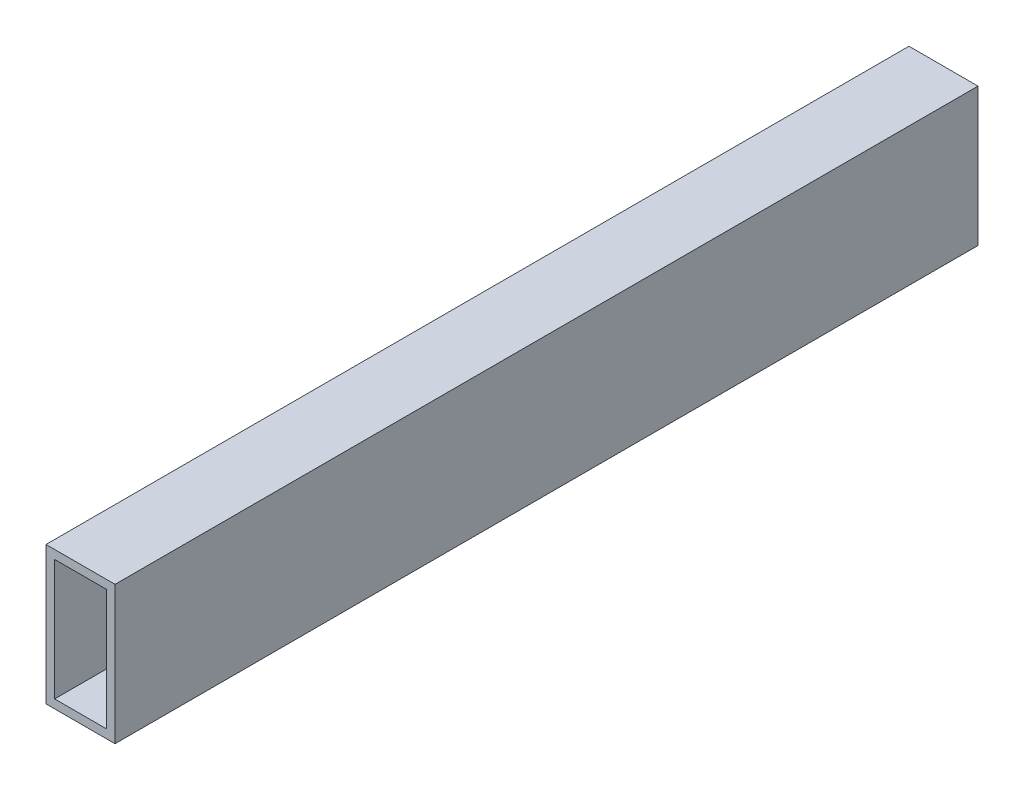
ISO-10303-21;
HEADER;
FILE_DESCRIPTION(('STEP AP214'),'2;1');
FILE_NAME('part.step','',(''),(''),'','','');
FILE_SCHEMA(('AUTOMOTIVE_DESIGN { 1 0 10303 214 1 1 1 1 }'));
ENDSEC;
DATA;
#1=APPLICATION_CONTEXT('core data for automotive mechanical design processes');
#2=APPLICATION_PROTOCOL_DEFINITION('international standard','automotive_design',2000,#1);
#3=PRODUCT_CONTEXT('',#1,'mechanical');
#4=PRODUCT('Part','Part','',(#3));
#5=PRODUCT_RELATED_PRODUCT_CATEGORY('part','',(#4));
#6=PRODUCT_DEFINITION_FORMATION('','',#4);
#7=PRODUCT_DEFINITION_CONTEXT('part definition',#1,'design');
#8=PRODUCT_DEFINITION('design','',#6,#7);
#9=PRODUCT_DEFINITION_SHAPE('','',#8);
#10=(LENGTH_UNIT() NAMED_UNIT(*) SI_UNIT(.MILLI.,.METRE.));
#11=(NAMED_UNIT(*) PLANE_ANGLE_UNIT() SI_UNIT($,.RADIAN.));
#12=(NAMED_UNIT(*) SI_UNIT($,.STERADIAN.) SOLID_ANGLE_UNIT());
#13=UNCERTAINTY_MEASURE_WITH_UNIT(LENGTH_MEASURE(1.E-05),#10,'distance_accuracy_value','');
#14=(GEOMETRIC_REPRESENTATION_CONTEXT(3) GLOBAL_UNCERTAINTY_ASSIGNED_CONTEXT((#13)) GLOBAL_UNIT_ASSIGNED_CONTEXT((#10,
#11,#12)) REPRESENTATION_CONTEXT('',''));
#15=CARTESIAN_POINT('',(0.,0.,0.));
#16=DIRECTION('',(0.,0.,1.));
#17=DIRECTION('',(1.,0.,0.));
#18=AXIS2_PLACEMENT_3D('',#15,#16,#17);
#19=CARTESIAN_POINT('',(0.,0.,158.75));
#20=DIRECTION('',(0.,0.,-1.));
#21=DIRECTION('',(-1.,0.,0.));
#22=AXIS2_PLACEMENT_3D('',#19,#20,#21);
#23=PLANE('',#22);
#24=DIRECTION('',(0.,1.,0.));
#25=VECTOR('',#24,1.);
#26=CARTESIAN_POINT('',(12.7,-25.4,158.75));
#27=LINE('',#26,#25);
#28=CARTESIAN_POINT('',(12.7,-25.4,158.75));
#29=VERTEX_POINT('',#28);
#30=CARTESIAN_POINT('',(12.7,25.4,158.75));
#31=VERTEX_POINT('',#30);
#32=EDGE_CURVE('E135',#29,#31,#27,.T.);
#33=ORIENTED_EDGE('',*,*,#32,.T.);
#34=DIRECTION('',(-1.,0.,0.));
#35=VECTOR('',#34,1.);
#36=CARTESIAN_POINT('',(-12.7,25.4,158.75));
#37=LINE('',#36,#35);
#38=CARTESIAN_POINT('',(-12.7,25.4,158.75));
#39=VERTEX_POINT('',#38);
#40=EDGE_CURVE('E138',#31,#39,#37,.T.);
#41=ORIENTED_EDGE('',*,*,#40,.T.);
#42=DIRECTION('',(0.,-1.,0.));
#43=VECTOR('',#42,1.);
#44=CARTESIAN_POINT('',(-12.7,-25.4,158.75));
#45=LINE('',#44,#43);
#46=CARTESIAN_POINT('',(-12.7,-25.4,158.75));
#47=VERTEX_POINT('',#46);
#48=EDGE_CURVE('E141',#39,#47,#45,.T.);
#49=ORIENTED_EDGE('',*,*,#48,.T.);
#50=DIRECTION('',(1.,0.,0.));
#51=VECTOR('',#50,1.);
#52=CARTESIAN_POINT('',(-12.7,-25.4,158.75));
#53=LINE('',#52,#51);
#54=EDGE_CURVE('E143',#47,#29,#53,.T.);
#55=ORIENTED_EDGE('',*,*,#54,.T.);
#56=EDGE_LOOP('',(#33,#41,#49,#55));
#57=FACE_BOUND('',#56,.T.);
#58=DIRECTION('',(0.,1.,0.));
#59=VECTOR('',#58,1.);
#60=CARTESIAN_POINT('',(9.52500000000001,-22.225,158.75));
#61=LINE('',#60,#59);
#62=CARTESIAN_POINT('',(9.52500000000001,-22.225,158.75));
#63=VERTEX_POINT('',#62);
#64=CARTESIAN_POINT('',(9.52500000000001,22.225,158.75));
#65=VERTEX_POINT('',#64);
#66=EDGE_CURVE('E99',#63,#65,#61,.T.);
#67=ORIENTED_EDGE('',*,*,#66,.F.);
#68=DIRECTION('',(1.,0.,0.));
#69=VECTOR('',#68,1.);
#70=CARTESIAN_POINT('',(-9.525,-22.225,158.75));
#71=LINE('',#70,#69);
#72=CARTESIAN_POINT('',(-9.525,-22.225,158.75));
#73=VERTEX_POINT('',#72);
#74=EDGE_CURVE('E121',#73,#63,#71,.T.);
#75=ORIENTED_EDGE('',*,*,#74,.F.);
#76=DIRECTION('',(0.,-1.,0.));
#77=VECTOR('',#76,1.);
#78=CARTESIAN_POINT('',(-9.525,-22.225,158.75));
#79=LINE('',#78,#77);
#80=CARTESIAN_POINT('',(-9.52500000000001,22.225,158.75));
#81=VERTEX_POINT('',#80);
#82=EDGE_CURVE('E119',#81,#73,#79,.T.);
#83=ORIENTED_EDGE('',*,*,#82,.F.);
#84=DIRECTION('',(-1.,0.,0.));
#85=VECTOR('',#84,1.);
#86=CARTESIAN_POINT('',(-9.52500000000001,22.225,158.75));
#87=LINE('',#86,#85);
#88=EDGE_CURVE('E107',#65,#81,#87,.T.);
#89=ORIENTED_EDGE('',*,*,#88,.F.);
#90=EDGE_LOOP('',(#67,#75,#83,#89));
#91=FACE_BOUND('',#90,.T.);
#92=ADVANCED_FACE('F34',(#57,#91),#23,.F.);
#93=CARTESIAN_POINT('',(0.,0.,-158.75));
#94=DIRECTION('',(0.,0.,-1.));
#95=DIRECTION('',(-1.,0.,0.));
#96=AXIS2_PLACEMENT_3D('',#93,#94,#95);
#97=PLANE('',#96);
#98=DIRECTION('',(0.,1.,0.));
#99=VECTOR('',#98,1.);
#100=CARTESIAN_POINT('',(12.7,-25.4,-158.75));
#101=LINE('',#100,#99);
#102=CARTESIAN_POINT('',(12.7,-25.4,-158.75));
#103=VERTEX_POINT('',#102);
#104=CARTESIAN_POINT('',(12.7,25.4,-158.75));
#105=VERTEX_POINT('',#104);
#106=EDGE_CURVE('E115',#103,#105,#101,.T.);
#107=ORIENTED_EDGE('',*,*,#106,.F.);
#108=DIRECTION('',(1.,0.,0.));
#109=VECTOR('',#108,1.);
#110=CARTESIAN_POINT('',(-12.7,-25.4,-158.75));
#111=LINE('',#110,#109);
#112=CARTESIAN_POINT('',(-12.7,-25.4,-158.75));
#113=VERTEX_POINT('',#112);
#114=EDGE_CURVE('E139',#113,#103,#111,.T.);
#115=ORIENTED_EDGE('',*,*,#114,.F.);
#116=DIRECTION('',(0.,-1.,0.));
#117=VECTOR('',#116,1.);
#118=CARTESIAN_POINT('',(-12.7,-25.4,-158.75));
#119=LINE('',#118,#117);
#120=CARTESIAN_POINT('',(-12.7,25.4,-158.75));
#121=VERTEX_POINT('',#120);
#122=EDGE_CURVE('E150',#121,#113,#119,.T.);
#123=ORIENTED_EDGE('',*,*,#122,.F.);
#124=DIRECTION('',(-1.,0.,0.));
#125=VECTOR('',#124,1.);
#126=CARTESIAN_POINT('',(-12.7,25.4,-158.75));
#127=LINE('',#126,#125);
#128=EDGE_CURVE('E148',#105,#121,#127,.T.);
#129=ORIENTED_EDGE('',*,*,#128,.F.);
#130=EDGE_LOOP('',(#107,#115,#123,#129));
#131=FACE_BOUND('',#130,.T.);
#132=DIRECTION('',(1.,0.,0.));
#133=VECTOR('',#132,1.);
#134=CARTESIAN_POINT('',(-9.525,-22.225,-158.75));
#135=LINE('',#134,#133);
#136=CARTESIAN_POINT('',(-9.525,-22.225,-158.75));
#137=VERTEX_POINT('',#136);
#138=CARTESIAN_POINT('',(9.52500000000001,-22.225,-158.75));
#139=VERTEX_POINT('',#138);
#140=EDGE_CURVE('E108',#137,#139,#135,.T.);
#141=ORIENTED_EDGE('',*,*,#140,.T.);
#142=DIRECTION('',(0.,1.,0.));
#143=VECTOR('',#142,1.);
#144=CARTESIAN_POINT('',(9.52500000000001,-22.225,-158.75));
#145=LINE('',#144,#143);
#146=CARTESIAN_POINT('',(9.52500000000001,22.225,-158.75));
#147=VERTEX_POINT('',#146);
#148=EDGE_CURVE('E57',#139,#147,#145,.T.);
#149=ORIENTED_EDGE('',*,*,#148,.T.);
#150=DIRECTION('',(-1.,0.,0.));
#151=VECTOR('',#150,1.);
#152=CARTESIAN_POINT('',(-9.52500000000001,22.225,-158.75));
#153=LINE('',#152,#151);
#154=CARTESIAN_POINT('',(-9.52500000000001,22.225,-158.75));
#155=VERTEX_POINT('',#154);
#156=EDGE_CURVE('E114',#147,#155,#153,.T.);
#157=ORIENTED_EDGE('',*,*,#156,.T.);
#158=DIRECTION('',(0.,-1.,0.));
#159=VECTOR('',#158,1.);
#160=CARTESIAN_POINT('',(-9.525,-22.225,-158.75));
#161=LINE('',#160,#159);
#162=EDGE_CURVE('E127',#155,#137,#161,.T.);
#163=ORIENTED_EDGE('',*,*,#162,.T.);
#164=EDGE_LOOP('',(#141,#149,#157,#163));
#165=FACE_BOUND('',#164,.T.);
#166=ADVANCED_FACE('F168',(#131,#165),#97,.T.);
#167=CARTESIAN_POINT('',(12.7,-25.4,158.75));
#168=DIRECTION('',(-1.,0.,0.));
#169=DIRECTION('',(0.,0.,1.));
#170=AXIS2_PLACEMENT_3D('',#167,#168,#169);
#171=PLANE('',#170);
#172=ORIENTED_EDGE('',*,*,#106,.T.);
#173=DIRECTION('',(0.,0.,-1.));
#174=VECTOR('',#173,1.);
#175=CARTESIAN_POINT('',(12.7,25.4,158.75));
#176=LINE('',#175,#174);
#177=EDGE_CURVE('E11',#31,#105,#176,.T.);
#178=ORIENTED_EDGE('',*,*,#177,.F.);
#179=ORIENTED_EDGE('',*,*,#32,.F.);
#180=DIRECTION('',(0.,0.,-1.));
#181=VECTOR('',#180,1.);
#182=CARTESIAN_POINT('',(12.7,-25.4,158.75));
#183=LINE('',#182,#181);
#184=EDGE_CURVE('E145',#29,#103,#183,.T.);
#185=ORIENTED_EDGE('',*,*,#184,.T.);
#186=EDGE_LOOP('',(#172,#178,#179,#185));
#187=FACE_BOUND('',#186,.T.);
#188=ADVANCED_FACE('F36',(#187),#171,.F.);
#189=CARTESIAN_POINT('',(-12.7,25.4,158.75));
#190=DIRECTION('',(0.,-1.,0.));
#191=DIRECTION('',(0.,0.,-1.));
#192=AXIS2_PLACEMENT_3D('',#189,#190,#191);
#193=PLANE('',#192);
#194=ORIENTED_EDGE('',*,*,#128,.T.);
#195=DIRECTION('',(0.,0.,-1.));
#196=VECTOR('',#195,1.);
#197=CARTESIAN_POINT('',(-12.7,25.4,158.75));
#198=LINE('',#197,#196);
#199=EDGE_CURVE('E42',#39,#121,#198,.T.);
#200=ORIENTED_EDGE('',*,*,#199,.F.);
#201=ORIENTED_EDGE('',*,*,#40,.F.);
#202=ORIENTED_EDGE('',*,*,#177,.T.);
#203=EDGE_LOOP('',(#194,#200,#201,#202));
#204=FACE_BOUND('',#203,.T.);
#205=ADVANCED_FACE('F178',(#204),#193,.F.);
#206=CARTESIAN_POINT('',(-12.7,-25.4,158.75));
#207=DIRECTION('',(1.,0.,0.));
#208=DIRECTION('',(0.,0.,-1.));
#209=AXIS2_PLACEMENT_3D('',#206,#207,#208);
#210=PLANE('',#209);
#211=ORIENTED_EDGE('',*,*,#122,.T.);
#212=DIRECTION('',(0.,0.,-1.));
#213=VECTOR('',#212,1.);
#214=CARTESIAN_POINT('',(-12.7,-25.4,158.75));
#215=LINE('',#214,#213);
#216=EDGE_CURVE('E155',#47,#113,#215,.T.);
#217=ORIENTED_EDGE('',*,*,#216,.F.);
#218=ORIENTED_EDGE('',*,*,#48,.F.);
#219=ORIENTED_EDGE('',*,*,#199,.T.);
#220=EDGE_LOOP('',(#211,#217,#218,#219));
#221=FACE_BOUND('',#220,.T.);
#222=ADVANCED_FACE('F162',(#221),#210,.F.);
#223=CARTESIAN_POINT('',(-12.7,-25.4,158.75));
#224=DIRECTION('',(0.,1.,0.));
#225=DIRECTION('',(0.,0.,1.));
#226=AXIS2_PLACEMENT_3D('',#223,#224,#225);
#227=PLANE('',#226);
#228=ORIENTED_EDGE('',*,*,#114,.T.);
#229=ORIENTED_EDGE('',*,*,#184,.F.);
#230=ORIENTED_EDGE('',*,*,#54,.F.);
#231=ORIENTED_EDGE('',*,*,#216,.T.);
#232=EDGE_LOOP('',(#228,#229,#230,#231));
#233=FACE_BOUND('',#232,.T.);
#234=ADVANCED_FACE('F172',(#233),#227,.F.);
#235=CARTESIAN_POINT('',(9.52500000000001,-22.225,158.75));
#236=DIRECTION('',(-1.,0.,0.));
#237=DIRECTION('',(0.,0.,1.));
#238=AXIS2_PLACEMENT_3D('',#235,#236,#237);
#239=PLANE('',#238);
#240=ORIENTED_EDGE('',*,*,#148,.F.);
#241=DIRECTION('',(0.,0.,-1.));
#242=VECTOR('',#241,1.);
#243=CARTESIAN_POINT('',(9.52500000000001,-22.225,158.75));
#244=LINE('',#243,#242);
#245=EDGE_CURVE('E103',#63,#139,#244,.T.);
#246=ORIENTED_EDGE('',*,*,#245,.F.);
#247=ORIENTED_EDGE('',*,*,#66,.T.);
#248=DIRECTION('',(0.,0.,-1.));
#249=VECTOR('',#248,1.);
#250=CARTESIAN_POINT('',(9.52500000000001,22.225,158.75));
#251=LINE('',#250,#249);
#252=EDGE_CURVE('E102',#65,#147,#251,.T.);
#253=ORIENTED_EDGE('',*,*,#252,.T.);
#254=EDGE_LOOP('',(#240,#246,#247,#253));
#255=FACE_BOUND('',#254,.T.);
#256=ADVANCED_FACE('F101',(#255),#239,.T.);
#257=CARTESIAN_POINT('',(-9.52500000000001,22.225,158.75));
#258=DIRECTION('',(0.,-1.,0.));
#259=DIRECTION('',(1.,0.,0.));
#260=AXIS2_PLACEMENT_3D('',#257,#258,#259);
#261=PLANE('',#260);
#262=ORIENTED_EDGE('',*,*,#156,.F.);
#263=ORIENTED_EDGE('',*,*,#252,.F.);
#264=ORIENTED_EDGE('',*,*,#88,.T.);
#265=DIRECTION('',(0.,0.,-1.));
#266=VECTOR('',#265,1.);
#267=CARTESIAN_POINT('',(-9.52500000000001,22.225,158.75));
#268=LINE('',#267,#266);
#269=EDGE_CURVE('E116',#81,#155,#268,.T.);
#270=ORIENTED_EDGE('',*,*,#269,.T.);
#271=EDGE_LOOP('',(#262,#263,#264,#270));
#272=FACE_BOUND('',#271,.T.);
#273=ADVANCED_FACE('F111',(#272),#261,.T.);
#274=CARTESIAN_POINT('',(-9.525,-22.225,158.75));
#275=DIRECTION('',(1.,0.,0.));
#276=DIRECTION('',(0.,1.,0.));
#277=AXIS2_PLACEMENT_3D('',#274,#275,#276);
#278=PLANE('',#277);
#279=ORIENTED_EDGE('',*,*,#162,.F.);
#280=ORIENTED_EDGE('',*,*,#269,.F.);
#281=ORIENTED_EDGE('',*,*,#82,.T.);
#282=DIRECTION('',(0.,0.,-1.));
#283=VECTOR('',#282,1.);
#284=CARTESIAN_POINT('',(-9.525,-22.225,158.75));
#285=LINE('',#284,#283);
#286=EDGE_CURVE('E49',#73,#137,#285,.T.);
#287=ORIENTED_EDGE('',*,*,#286,.T.);
#288=EDGE_LOOP('',(#279,#280,#281,#287));
#289=FACE_BOUND('',#288,.T.);
#290=ADVANCED_FACE('F201',(#289),#278,.T.);
#291=CARTESIAN_POINT('',(-9.525,-22.225,158.75));
#292=DIRECTION('',(0.,1.,0.));
#293=DIRECTION('',(-1.,0.,0.));
#294=AXIS2_PLACEMENT_3D('',#291,#292,#293);
#295=PLANE('',#294);
#296=ORIENTED_EDGE('',*,*,#140,.F.);
#297=ORIENTED_EDGE('',*,*,#286,.F.);
#298=ORIENTED_EDGE('',*,*,#74,.T.);
#299=ORIENTED_EDGE('',*,*,#245,.T.);
#300=EDGE_LOOP('',(#296,#297,#298,#299));
#301=FACE_BOUND('',#300,.T.);
#302=ADVANCED_FACE('F205',(#301),#295,.T.);
#303=CLOSED_SHELL('',(#92,#166,#188,#205,#222,#234,#256,#273,#290,#302));
#304=MANIFOLD_SOLID_BREP('B2',#303);
#305=ADVANCED_BREP_SHAPE_REPRESENTATION('',(#18,#304),#14);
#306=SHAPE_DEFINITION_REPRESENTATION(#9,#305);
ENDSEC;
END-ISO-10303-21;
